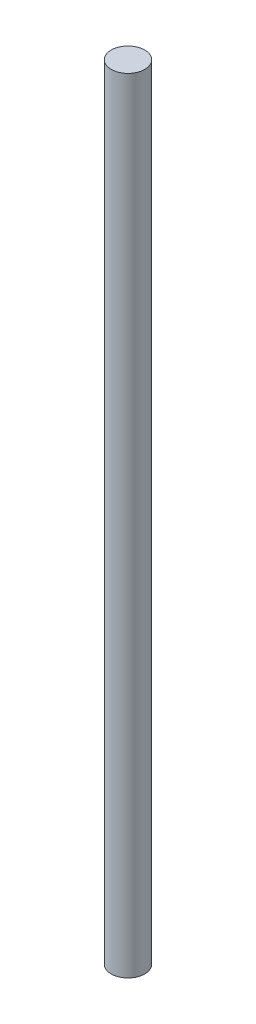
ISO-10303-21;
HEADER;
FILE_DESCRIPTION(('STEP AP214'),'2;1');
FILE_NAME('part.step','',(''),(''),'','','');
FILE_SCHEMA(('AUTOMOTIVE_DESIGN { 1 0 10303 214 1 1 1 1 }'));
ENDSEC;
DATA;
#1=APPLICATION_CONTEXT('core data for automotive mechanical design processes');
#2=APPLICATION_PROTOCOL_DEFINITION('international standard','automotive_design',2000,#1);
#3=PRODUCT_CONTEXT('',#1,'mechanical');
#4=PRODUCT('Part','Part','',(#3));
#5=PRODUCT_RELATED_PRODUCT_CATEGORY('part','',(#4));
#6=PRODUCT_DEFINITION_FORMATION('','',#4);
#7=PRODUCT_DEFINITION_CONTEXT('part definition',#1,'design');
#8=PRODUCT_DEFINITION('design','',#6,#7);
#9=PRODUCT_DEFINITION_SHAPE('','',#8);
#10=(LENGTH_UNIT() NAMED_UNIT(*) SI_UNIT(.MILLI.,.METRE.));
#11=(NAMED_UNIT(*) PLANE_ANGLE_UNIT() SI_UNIT($,.RADIAN.));
#12=(NAMED_UNIT(*) SI_UNIT($,.STERADIAN.) SOLID_ANGLE_UNIT());
#13=UNCERTAINTY_MEASURE_WITH_UNIT(LENGTH_MEASURE(1.E-05),#10,'distance_accuracy_value','');
#14=(GEOMETRIC_REPRESENTATION_CONTEXT(3) GLOBAL_UNCERTAINTY_ASSIGNED_CONTEXT((#13)) GLOBAL_UNIT_ASSIGNED_CONTEXT((#10,
#11,#12)) REPRESENTATION_CONTEXT('',''));
#15=CARTESIAN_POINT('',(0.,0.,0.));
#16=DIRECTION('',(0.,0.,1.));
#17=DIRECTION('',(1.,0.,0.));
#18=AXIS2_PLACEMENT_3D('',#15,#16,#17);
#19=CARTESIAN_POINT('',(0.,140.,0.));
#20=DIRECTION('',(0.,-1.,0.));
#21=DIRECTION('',(0.,0.,-1.));
#22=AXIS2_PLACEMENT_3D('',#19,#20,#21);
#23=CYLINDRICAL_SURFACE('',#22,3.);
#24=CARTESIAN_POINT('',(0.,140.,0.));
#25=DIRECTION('',(0.,1.,0.));
#26=DIRECTION('',(0.,0.,1.));
#27=AXIS2_PLACEMENT_3D('',#24,#25,#26);
#28=CIRCLE('',#27,3.);
#29=CARTESIAN_POINT('',(0.,140.,3.));
#30=VERTEX_POINT('',#29);
#31=EDGE_CURVE('E10',#30,#30,#28,.T.);
#32=ORIENTED_EDGE('',*,*,#31,.F.);
#33=EDGE_LOOP('',(#32));
#34=FACE_BOUND('',#33,.T.);
#35=CARTESIAN_POINT('',(0.,0.,0.));
#36=DIRECTION('',(0.,1.,0.));
#37=DIRECTION('',(0.,0.,1.));
#38=AXIS2_PLACEMENT_3D('',#35,#36,#37);
#39=CIRCLE('',#38,3.);
#40=CARTESIAN_POINT('',(0.,0.,3.));
#41=VERTEX_POINT('',#40);
#42=EDGE_CURVE('E37',#41,#41,#39,.T.);
#43=ORIENTED_EDGE('',*,*,#42,.T.);
#44=EDGE_LOOP('',(#43));
#45=FACE_BOUND('',#44,.T.);
#46=ADVANCED_FACE('F34',(#34,#45),#23,.T.);
#47=CARTESIAN_POINT('',(0.,140.,0.));
#48=DIRECTION('',(0.,1.,0.));
#49=DIRECTION('',(0.,0.,1.));
#50=AXIS2_PLACEMENT_3D('',#47,#48,#49);
#51=PLANE('',#50);
#52=ORIENTED_EDGE('',*,*,#31,.T.);
#53=EDGE_LOOP('',(#52));
#54=FACE_BOUND('',#53,.T.);
#55=ADVANCED_FACE('F49',(#54),#51,.T.);
#56=CARTESIAN_POINT('',(0.,0.,0.));
#57=DIRECTION('',(0.,1.,0.));
#58=DIRECTION('',(0.,0.,1.));
#59=AXIS2_PLACEMENT_3D('',#56,#57,#58);
#60=PLANE('',#59);
#61=ORIENTED_EDGE('',*,*,#42,.F.);
#62=EDGE_LOOP('',(#61));
#63=FACE_BOUND('',#62,.T.);
#64=ADVANCED_FACE('F47',(#63),#60,.F.);
#65=CLOSED_SHELL('',(#46,#55,#64));
#66=MANIFOLD_SOLID_BREP('B2',#65);
#67=ADVANCED_BREP_SHAPE_REPRESENTATION('',(#18,#66),#14);
#68=SHAPE_DEFINITION_REPRESENTATION(#9,#67);
ENDSEC;
END-ISO-10303-21;
